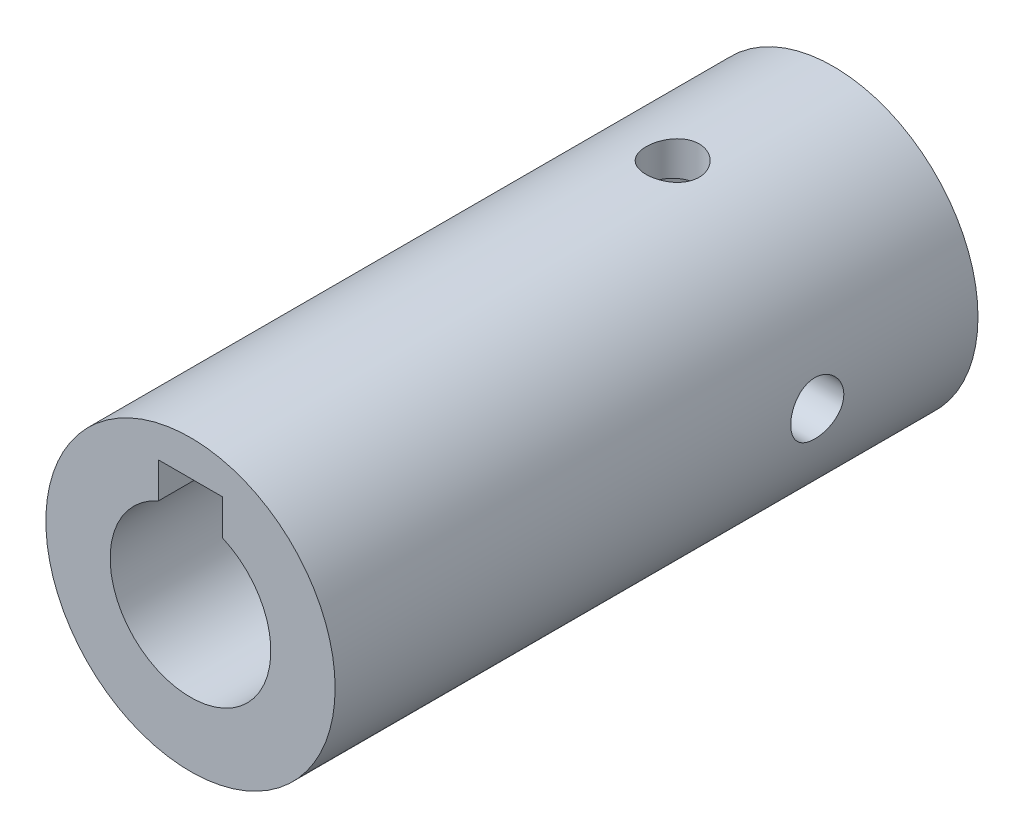
ISO-10303-21;
HEADER;
FILE_DESCRIPTION(('STEP AP214'),'2;1');
FILE_NAME('part.step','',(''),(''),'','','');
FILE_SCHEMA(('AUTOMOTIVE_DESIGN { 1 0 10303 214 1 1 1 1 }'));
ENDSEC;
DATA;
#1=APPLICATION_CONTEXT('core data for automotive mechanical design processes');
#2=APPLICATION_PROTOCOL_DEFINITION('international standard','automotive_design',2000,#1);
#3=PRODUCT_CONTEXT('',#1,'mechanical');
#4=PRODUCT('Part','Part','',(#3));
#5=PRODUCT_RELATED_PRODUCT_CATEGORY('part','',(#4));
#6=PRODUCT_DEFINITION_FORMATION('','',#4);
#7=PRODUCT_DEFINITION_CONTEXT('part definition',#1,'design');
#8=PRODUCT_DEFINITION('design','',#6,#7);
#9=PRODUCT_DEFINITION_SHAPE('','',#8);
#10=(LENGTH_UNIT() NAMED_UNIT(*) SI_UNIT(.MILLI.,.METRE.));
#11=(NAMED_UNIT(*) PLANE_ANGLE_UNIT() SI_UNIT($,.RADIAN.));
#12=(NAMED_UNIT(*) SI_UNIT($,.STERADIAN.) SOLID_ANGLE_UNIT());
#13=UNCERTAINTY_MEASURE_WITH_UNIT(LENGTH_MEASURE(1.E-05),#10,'distance_accuracy_value','');
#14=(GEOMETRIC_REPRESENTATION_CONTEXT(3) GLOBAL_UNCERTAINTY_ASSIGNED_CONTEXT((#13)) GLOBAL_UNIT_ASSIGNED_CONTEXT((#10,
#11,#12)) REPRESENTATION_CONTEXT('',''));
#15=CARTESIAN_POINT('',(0.,0.,0.));
#16=DIRECTION('',(0.,0.,1.));
#17=DIRECTION('',(1.,0.,0.));
#18=AXIS2_PLACEMENT_3D('',#15,#16,#17);
#19=CARTESIAN_POINT('',(0.,0.,40.));
#20=DIRECTION('',(0.,0.,1.));
#21=DIRECTION('',(1.,0.,0.));
#22=AXIS2_PLACEMENT_3D('',#19,#20,#21);
#23=PLANE('',#22);
#24=DIRECTION('',(0.,1.,0.));
#25=VECTOR('',#24,1.);
#26=CARTESIAN_POINT('',(2.,6.8,40.));
#27=LINE('',#26,#25);
#28=CARTESIAN_POINT('',(2.,4.58257569495584,40.));
#29=VERTEX_POINT('',#28);
#30=CARTESIAN_POINT('',(2.,6.8,40.));
#31=VERTEX_POINT('',#30);
#32=EDGE_CURVE('E87',#29,#31,#27,.T.);
#33=ORIENTED_EDGE('',*,*,#32,.F.);
#34=CARTESIAN_POINT('',(0.,0.,40.));
#35=DIRECTION('',(0.,0.,1.));
#36=DIRECTION('',(1.,0.,0.));
#37=AXIS2_PLACEMENT_3D('',#34,#35,#36);
#38=CIRCLE('',#37,5.);
#39=CARTESIAN_POINT('',(-2.,4.58257569495584,40.));
#40=VERTEX_POINT('',#39);
#41=EDGE_CURVE('E115',#40,#29,#38,.T.);
#42=ORIENTED_EDGE('',*,*,#41,.F.);
#43=DIRECTION('',(0.,-1.,0.));
#44=VECTOR('',#43,1.);
#45=CARTESIAN_POINT('',(-2.,6.8,40.));
#46=LINE('',#45,#44);
#47=CARTESIAN_POINT('',(-2.,6.8,40.));
#48=VERTEX_POINT('',#47);
#49=EDGE_CURVE('E56',#48,#40,#46,.T.);
#50=ORIENTED_EDGE('',*,*,#49,.F.);
#51=DIRECTION('',(-1.,0.,0.));
#52=VECTOR('',#51,1.);
#53=CARTESIAN_POINT('',(-2.,6.8,40.));
#54=LINE('',#53,#52);
#55=EDGE_CURVE('E105',#31,#48,#54,.T.);
#56=ORIENTED_EDGE('',*,*,#55,.F.);
#57=EDGE_LOOP('',(#33,#42,#50,#56));
#58=FACE_BOUND('',#57,.T.);
#59=CARTESIAN_POINT('',(0.,0.,40.));
#60=DIRECTION('',(0.,0.,1.));
#61=DIRECTION('',(1.,0.,0.));
#62=AXIS2_PLACEMENT_3D('',#59,#60,#61);
#63=CIRCLE('',#62,9.);
#64=CARTESIAN_POINT('',(9.,0.,40.));
#65=VERTEX_POINT('',#64);
#66=EDGE_CURVE('E120',#65,#65,#63,.T.);
#67=ORIENTED_EDGE('',*,*,#66,.T.);
#68=EDGE_LOOP('',(#67));
#69=FACE_BOUND('',#68,.T.);
#70=ADVANCED_FACE('F36',(#58,#69),#23,.T.);
#71=CARTESIAN_POINT('',(0.,0.,0.));
#72=DIRECTION('',(0.,0.,1.));
#73=DIRECTION('',(1.,0.,0.));
#74=AXIS2_PLACEMENT_3D('',#71,#72,#73);
#75=PLANE('',#74);
#76=CARTESIAN_POINT('',(0.,0.,0.));
#77=DIRECTION('',(0.,0.,1.));
#78=DIRECTION('',(1.,0.,0.));
#79=AXIS2_PLACEMENT_3D('',#76,#77,#78);
#80=CIRCLE('',#79,5.);
#81=CARTESIAN_POINT('',(-2.,4.58257569495584,0.));
#82=VERTEX_POINT('',#81);
#83=CARTESIAN_POINT('',(2.,4.58257569495584,0.));
#84=VERTEX_POINT('',#83);
#85=EDGE_CURVE('E103',#82,#84,#80,.T.);
#86=ORIENTED_EDGE('',*,*,#85,.T.);
#87=DIRECTION('',(0.,1.,0.));
#88=VECTOR('',#87,1.);
#89=CARTESIAN_POINT('',(2.,6.8,0.));
#90=LINE('',#89,#88);
#91=CARTESIAN_POINT('',(2.,6.8,0.));
#92=VERTEX_POINT('',#91);
#93=EDGE_CURVE('E84',#84,#92,#90,.T.);
#94=ORIENTED_EDGE('',*,*,#93,.T.);
#95=DIRECTION('',(-1.,0.,0.));
#96=VECTOR('',#95,1.);
#97=CARTESIAN_POINT('',(-2.,6.8,0.));
#98=LINE('',#97,#96);
#99=CARTESIAN_POINT('',(-2.,6.8,0.));
#100=VERTEX_POINT('',#99);
#101=EDGE_CURVE('E95',#92,#100,#98,.T.);
#102=ORIENTED_EDGE('',*,*,#101,.T.);
#103=DIRECTION('',(0.,-1.,0.));
#104=VECTOR('',#103,1.);
#105=CARTESIAN_POINT('',(-2.,6.8,0.));
#106=LINE('',#105,#104);
#107=EDGE_CURVE('E92',#100,#82,#106,.T.);
#108=ORIENTED_EDGE('',*,*,#107,.T.);
#109=EDGE_LOOP('',(#86,#94,#102,#108));
#110=FACE_BOUND('',#109,.T.);
#111=CARTESIAN_POINT('',(0.,0.,0.));
#112=DIRECTION('',(0.,0.,1.));
#113=DIRECTION('',(1.,0.,0.));
#114=AXIS2_PLACEMENT_3D('',#111,#112,#113);
#115=CIRCLE('',#114,9.);
#116=CARTESIAN_POINT('',(9.,0.,0.));
#117=VERTEX_POINT('',#116);
#118=EDGE_CURVE('E118',#117,#117,#115,.T.);
#119=ORIENTED_EDGE('',*,*,#118,.F.);
#120=EDGE_LOOP('',(#119));
#121=FACE_BOUND('',#120,.T.);
#122=ADVANCED_FACE('F100',(#110,#121),#75,.F.);
#123=CARTESIAN_POINT('',(0.,0.,40.));
#124=DIRECTION('',(0.,0.,-1.));
#125=DIRECTION('',(-1.,0.,0.));
#126=AXIS2_PLACEMENT_3D('',#123,#124,#125);
#127=CYLINDRICAL_SURFACE('',#126,9.);
#128=CARTESIAN_POINT('',(9.,0.,11.65));
#129=CARTESIAN_POINT('',(8.99999835060966,0.0918563401856291,11.6499964511914));
#130=CARTESIAN_POINT('',(8.99857918884985,0.183759286218882,11.6423035469141));
#131=CARTESIAN_POINT('',(8.99305463028745,0.364977948965814,11.6117535309859));
#132=CARTESIAN_POINT('',(8.98894692395007,0.454291372258896,11.5888833814225));
#133=CARTESIAN_POINT('',(8.97850503368058,0.627683743604389,11.5287005963663));
#134=CARTESIAN_POINT('',(8.97217282164655,0.711767250233595,11.4914007490276));
#135=CARTESIAN_POINT('',(8.95797438424648,0.872474263435695,11.4034531032473));
#136=CARTESIAN_POINT('',(8.95010829368215,0.949098424671128,11.3528064776222));
#137=CARTESIAN_POINT('',(8.9336102101443,1.09359910356556,11.2389858907854));
#138=CARTESIAN_POINT('',(8.92497117839848,1.16137765650479,11.1756885659969));
#139=CARTESIAN_POINT('',(8.90795346370862,1.28541590153586,11.0386287745025));
#140=CARTESIAN_POINT('',(8.8995747990063,1.34167478807872,10.9648655765476));
#141=CARTESIAN_POINT('',(8.88395813367482,1.44148110351233,10.8082795809184));
#142=CARTESIAN_POINT('',(8.87672921329071,1.48492945431507,10.725392646736));
#143=CARTESIAN_POINT('',(8.86432940629067,1.55724724466982,10.5533414665414));
#144=CARTESIAN_POINT('',(8.85915835034377,1.58611788379855,10.4641777377249));
#145=CARTESIAN_POINT('',(8.85153045632432,1.628147498374,10.2831502536457));
#146=CARTESIAN_POINT('',(8.84904418663057,1.64147697365671,10.1913273482505));
#147=CARTESIAN_POINT('',(8.84697857859139,1.65257498692856,10.0067172962398));
#148=CARTESIAN_POINT('',(8.84739899114242,1.65034485838023,9.91393023293356));
#149=CARTESIAN_POINT('',(8.85107243387296,1.63052535234045,9.7312571786351));
#150=CARTESIAN_POINT('',(8.85428979801769,1.61312935830109,9.64134938325371));
#151=CARTESIAN_POINT('',(8.86313864762649,1.56377625687946,9.4657504474543));
#152=CARTESIAN_POINT('',(8.86877023157548,1.53181855546815,9.38005947921519));
#153=CARTESIAN_POINT('',(8.88185052793626,1.4540586374682,9.21475808748164));
#154=CARTESIAN_POINT('',(8.88930950236372,1.40817787366259,9.13518545915314));
#155=CARTESIAN_POINT('',(8.90519728772881,1.30392981237182,8.98479541868752));
#156=CARTESIAN_POINT('',(8.91362619286663,1.24556130159629,8.91397885833225));
#157=CARTESIAN_POINT('',(8.93065979872225,1.11694967129332,8.78199341422243));
#158=CARTESIAN_POINT('',(8.93926523580672,1.04654103501511,8.72098579665601));
#159=CARTESIAN_POINT('',(8.95556555246463,0.896402881240975,8.6116242921601));
#160=CARTESIAN_POINT('',(8.96326042365318,0.816673277926886,8.56327052174789));
#161=CARTESIAN_POINT('',(8.97688712058931,0.649991673656466,8.4805674514699));
#162=CARTESIAN_POINT('',(8.98281689925138,0.563031435204716,8.44623439525882));
#163=CARTESIAN_POINT('',(8.9922293552611,0.384445293378825,8.39270757787582));
#164=CARTESIAN_POINT('',(8.99571228095924,0.292819864524539,8.37351228022857));
#165=CARTESIAN_POINT('',(8.9998046368878,0.108892206896277,8.35102910531887));
#166=CARTESIAN_POINT('',(9.00045399362833,0.0166178578028444,8.3475201812148));
#167=CARTESIAN_POINT('',(8.99891614087115,-0.167199268852813,8.35591717889622));
#168=CARTESIAN_POINT('',(8.99672906437169,-0.258742080513784,8.3678223779249));
#169=CARTESIAN_POINT('',(8.9897889173344,-0.437800271906288,8.40652587438453));
#170=CARTESIAN_POINT('',(8.98505503856335,-0.525340527688906,8.4332128258482));
#171=CARTESIAN_POINT('',(8.97354987691929,-0.694704345256288,8.50060216535141));
#172=CARTESIAN_POINT('',(8.96677846051344,-0.776527531931818,8.54130547199743));
#173=CARTESIAN_POINT('',(8.95184977853793,-0.933081448267931,8.63606489383059));
#174=CARTESIAN_POINT('',(8.94367870992649,-1.00772869905809,8.69025670761984));
#175=CARTESIAN_POINT('',(8.92689385571355,-1.14694904497453,8.81027058406274));
#176=CARTESIAN_POINT('',(8.91828003076047,-1.21152124257849,8.87609368176082));
#177=CARTESIAN_POINT('',(8.90144873167934,-1.32959418699788,9.01850049100402));
#178=CARTESIAN_POINT('',(8.89323765758647,-1.38294438582436,9.0952099064701));
#179=CARTESIAN_POINT('',(8.87826835621664,-1.4760019251271,9.25663173002978));
#180=CARTESIAN_POINT('',(8.87151007645345,-1.51570975850265,9.34134384884433));
#181=CARTESIAN_POINT('',(8.86026133433789,-1.58013949319581,9.51597613701553));
#182=CARTESIAN_POINT('',(8.85576025982359,-1.60493163214764,9.60586967724311));
#183=CARTESIAN_POINT('',(8.84951079711017,-1.63904383383449,9.78863616379072));
#184=CARTESIAN_POINT('',(8.84776211350983,-1.64836555694266,9.88150878928763));
#185=CARTESIAN_POINT('',(8.8472299450701,-1.65121867237614,10.0660901688092));
#186=CARTESIAN_POINT('',(8.84840188735807,-1.64498742277089,10.1577952099332));
#187=CARTESIAN_POINT('',(8.85348032699231,-1.61742979277769,10.3388272942866));
#188=CARTESIAN_POINT('',(8.8573868096795,-1.59610349330992,10.4281543502609));
#189=CARTESIAN_POINT('',(8.867475774888,-1.53905940273944,10.6017745964563));
#190=CARTESIAN_POINT('',(8.87365436407452,-1.50336621996412,10.6860761126321));
#191=CARTESIAN_POINT('',(8.88759431680627,-1.41862715875643,10.8475322777078));
#192=CARTESIAN_POINT('',(8.89535578533286,-1.36958039460183,10.9246864520806));
#193=CARTESIAN_POINT('',(8.91172595985397,-1.25869662766806,11.0708489633579));
#194=CARTESIAN_POINT('',(8.92034520947617,-1.19668647580681,11.1397247845049));
#195=CARTESIAN_POINT('',(8.93737982765602,-1.06199820645018,11.2661728663384));
#196=CARTESIAN_POINT('',(8.94579514890086,-0.989317640435666,11.3237425255149));
#197=CARTESIAN_POINT('',(8.96155795714123,-0.834608091559628,11.4264021209736));
#198=CARTESIAN_POINT('',(8.96889569784106,-0.752504485294222,11.4713811345629));
#199=CARTESIAN_POINT('',(8.9815815504526,-0.581799309328924,11.546835790754));
#200=CARTESIAN_POINT('',(8.98693155389526,-0.493204013757845,11.5773252293893));
#201=CARTESIAN_POINT('',(8.99393221000113,-0.33694160703953,11.616654539549));
#202=CARTESIAN_POINT('',(8.99619492659055,-0.270195109334186,11.6291380026608));
#203=CARTESIAN_POINT('',(8.99922941304804,-0.135640863042976,11.6458119455883));
#204=CARTESIAN_POINT('',(9.00000121802507,-0.0678331394854611,11.6500026206882));
#205=CARTESIAN_POINT('',(9.,0.,11.65));
#206=B_SPLINE_CURVE_WITH_KNOTS('',3,(#128,#129,#130,#131,#132,#133,#134,#135,#136,#137,#138,
#139,#140,#141,#142,#143,#144,#145,#146,#147,#148,#149,#150,#151,#152,#153,#154,#155,#156,#157,
#158,#159,#160,#161,#162,#163,#164,#165,#166,#167,#168,#169,#170,#171,#172,#173,#174,#175,#176,
#177,#178,#179,#180,#181,#182,#183,#184,#185,#186,#187,#188,#189,#190,#191,#192,#193,#194,#195,
#196,#197,#198,#199,#200,#201,#202,#203,#204,#205),.UNSPECIFIED.,.T.,.F.,(4,2,2,2,2,2,2,2,2,2,2,
2,2,2,2,2,2,2,2,2,2,2,2,2,2,2,2,2,2,2,2,2,2,2,2,2,2,2,4),(0.,0.275320976133016,
0.550878771625987,0.826192914580021,1.1014828730185,1.37960125011388,1.6577390688762,
1.93797477063959,2.2181874084928,2.49529605356488,2.77238095063822,3.04598351388715,
3.31959723945499,3.59478420042089,3.86999791028248,4.14935425298784,4.4287131679304,
4.7083948213042,4.98804808346798,5.26374788907696,5.53943476779431,5.81307268892924,
6.08672854721141,6.36325739026109,6.63981085345673,6.91986622510814,7.19991147728186,
7.47862746599062,7.75731353937686,8.03177259289667,8.30623017513215,8.58021963948807,
8.85422728156676,9.13215992874282,9.41015645255448,9.6905301063063,9.970636268935,
10.1739573020538,10.377273547177),.UNSPECIFIED.);
#207=CARTESIAN_POINT('',(9.,0.,11.65));
#208=VERTEX_POINT('',#207);
#209=EDGE_CURVE('E11',#208,#208,#206,.T.);
#210=ORIENTED_EDGE('',*,*,#209,.T.);
#211=EDGE_LOOP('',(#210));
#212=FACE_BOUND('',#211,.T.);
#213=CARTESIAN_POINT('',(0.,9.,8.35000000000001));
#214=CARTESIAN_POINT('',(0.0918563401856291,8.99999835060966,8.35000354880864));
#215=CARTESIAN_POINT('',(0.183759286218882,8.99857918884985,8.35769645308593));
#216=CARTESIAN_POINT('',(0.364977948965814,8.99305463028745,8.38824646901408));
#217=CARTESIAN_POINT('',(0.454291372258896,8.98894692395007,8.41111661857755));
#218=CARTESIAN_POINT('',(0.627683743604389,8.97850503368058,8.47129940363373));
#219=CARTESIAN_POINT('',(0.711767250233595,8.97217282164655,8.50859925097237));
#220=CARTESIAN_POINT('',(0.872474263435695,8.95797438424648,8.59654689675269));
#221=CARTESIAN_POINT('',(0.949098424671129,8.95010829368215,8.64719352237785));
#222=CARTESIAN_POINT('',(1.09359910356556,8.9336102101443,8.76101410921455));
#223=CARTESIAN_POINT('',(1.16137765650479,8.92497117839848,8.8243114340031));
#224=CARTESIAN_POINT('',(1.28541590153585,8.90795346370862,8.96137122549753));
#225=CARTESIAN_POINT('',(1.34167478807872,8.8995747990063,9.03513442345237));
#226=CARTESIAN_POINT('',(1.44148110351233,8.88395813367482,9.19172041908156));
#227=CARTESIAN_POINT('',(1.48492945431507,8.87672921329071,9.27460735326401));
#228=CARTESIAN_POINT('',(1.55724724466982,8.86432940629067,9.4466585334586));
#229=CARTESIAN_POINT('',(1.58611788379855,8.85915835034377,9.53582226227507));
#230=CARTESIAN_POINT('',(1.628147498374,8.85153045632432,9.71684974635425));
#231=CARTESIAN_POINT('',(1.64147697365671,8.84904418663057,9.80867265174954));
#232=CARTESIAN_POINT('',(1.65257498692856,8.84697857859139,9.99328270376019));
#233=CARTESIAN_POINT('',(1.65034485838023,8.84739899114242,10.0860697670664));
#234=CARTESIAN_POINT('',(1.63052535234045,8.85107243387296,10.2687428213649));
#235=CARTESIAN_POINT('',(1.61312935830109,8.85428979801769,10.3586506167463));
#236=CARTESIAN_POINT('',(1.56377625687946,8.86313864762649,10.5342495525457));
#237=CARTESIAN_POINT('',(1.53181855546815,8.86877023157548,10.6199405207848));
#238=CARTESIAN_POINT('',(1.4540586374682,8.88185052793626,10.7852419125184));
#239=CARTESIAN_POINT('',(1.40817787366259,8.88930950236372,10.8648145408469));
#240=CARTESIAN_POINT('',(1.30392981237182,8.90519728772881,11.0152045813125));
#241=CARTESIAN_POINT('',(1.24556130159629,8.91362619286663,11.0860211416678));
#242=CARTESIAN_POINT('',(1.11694967129332,8.93065979872225,11.2180065857776));
#243=CARTESIAN_POINT('',(1.04654103501511,8.93926523580672,11.279014203344));
#244=CARTESIAN_POINT('',(0.896402881240975,8.95556555246463,11.3883757078399));
#245=CARTESIAN_POINT('',(0.816673277926886,8.96326042365318,11.4367294782521));
#246=CARTESIAN_POINT('',(0.649991673656466,8.97688712058931,11.5194325485301));
#247=CARTESIAN_POINT('',(0.563031435204716,8.98281689925138,11.5537656047412));
#248=CARTESIAN_POINT('',(0.384445293378825,8.9922293552611,11.6072924221242));
#249=CARTESIAN_POINT('',(0.292819864524539,8.99571228095924,11.6264877197714));
#250=CARTESIAN_POINT('',(0.108892206896277,8.9998046368878,11.6489708946811));
#251=CARTESIAN_POINT('',(0.0166178578028442,9.00045399362833,11.6524798187852));
#252=CARTESIAN_POINT('',(-0.167199268852813,8.99891614087115,11.6440828211038));
#253=CARTESIAN_POINT('',(-0.258742080513784,8.99672906437169,11.6321776220751));
#254=CARTESIAN_POINT('',(-0.437800271906288,8.9897889173344,11.5934741256155));
#255=CARTESIAN_POINT('',(-0.525340527688906,8.98505503856335,11.5667871741518));
#256=CARTESIAN_POINT('',(-0.694704345256288,8.97354987691929,11.4993978346486));
#257=CARTESIAN_POINT('',(-0.776527531931818,8.96677846051344,11.4586945280026));
#258=CARTESIAN_POINT('',(-0.933081448267931,8.95184977853793,11.3639351061694));
#259=CARTESIAN_POINT('',(-1.00772869905809,8.94367870992649,11.3097432923802));
#260=CARTESIAN_POINT('',(-1.14694904497453,8.92689385571355,11.1897294159373));
#261=CARTESIAN_POINT('',(-1.21152124257849,8.91828003076047,11.1239063182392));
#262=CARTESIAN_POINT('',(-1.32959418699788,8.90144873167934,10.981499508996));
#263=CARTESIAN_POINT('',(-1.38294438582436,8.89323765758647,10.9047900935299));
#264=CARTESIAN_POINT('',(-1.4760019251271,8.87826835621664,10.7433682699702));
#265=CARTESIAN_POINT('',(-1.51570975850265,8.87151007645345,10.6586561511557));
#266=CARTESIAN_POINT('',(-1.58013949319581,8.86026133433789,10.4840238629845));
#267=CARTESIAN_POINT('',(-1.60493163214764,8.85576025982359,10.3941303227569));
#268=CARTESIAN_POINT('',(-1.63904383383449,8.84951079711017,10.2113638362093));
#269=CARTESIAN_POINT('',(-1.64836555694266,8.84776211350983,10.1184912107124));
#270=CARTESIAN_POINT('',(-1.65121867237614,8.8472299450701,9.93390983119083));
#271=CARTESIAN_POINT('',(-1.64498742277089,8.84840188735807,9.84220479006679));
#272=CARTESIAN_POINT('',(-1.61742979277769,8.85348032699231,9.66117270571342));
#273=CARTESIAN_POINT('',(-1.59610349330992,8.8573868096795,9.57184564973906));
#274=CARTESIAN_POINT('',(-1.53905940273943,8.86747577488801,9.39822540354369));
#275=CARTESIAN_POINT('',(-1.50336621996412,8.87365436407452,9.31392388736786));
#276=CARTESIAN_POINT('',(-1.41862715875642,8.88759431680627,9.15246772229217));
#277=CARTESIAN_POINT('',(-1.36958039460183,8.89535578533286,9.07531354791945));
#278=CARTESIAN_POINT('',(-1.25869662766806,8.91172595985397,8.92915103664209));
#279=CARTESIAN_POINT('',(-1.19668647580681,8.92034520947617,8.86027521549507));
#280=CARTESIAN_POINT('',(-1.06199820645018,8.93737982765602,8.7338271336616));
#281=CARTESIAN_POINT('',(-0.989317640435665,8.94579514890086,8.67625747448513));
#282=CARTESIAN_POINT('',(-0.834608091559628,8.96155795714123,8.57359787902638));
#283=CARTESIAN_POINT('',(-0.752504485294222,8.96889569784106,8.52861886543706));
#284=CARTESIAN_POINT('',(-0.581799309328924,8.9815815504526,8.453164209246));
#285=CARTESIAN_POINT('',(-0.493204013757845,8.98693155389526,8.42267477061075));
#286=CARTESIAN_POINT('',(-0.33694160703953,8.99393221000113,8.38334546045097));
#287=CARTESIAN_POINT('',(-0.270195109334186,8.99619492659055,8.37086199733922));
#288=CARTESIAN_POINT('',(-0.135640863042976,8.99922941304804,8.35418805441165));
#289=CARTESIAN_POINT('',(-0.0678331394854611,9.00000121802507,8.34999737931176));
#290=CARTESIAN_POINT('',(0.,9.,8.35000000000001));
#291=B_SPLINE_CURVE_WITH_KNOTS('',3,(#213,#214,#215,#216,#217,#218,#219,#220,#221,#222,#223,
#224,#225,#226,#227,#228,#229,#230,#231,#232,#233,#234,#235,#236,#237,#238,#239,#240,#241,#242,
#243,#244,#245,#246,#247,#248,#249,#250,#251,#252,#253,#254,#255,#256,#257,#258,#259,#260,#261,
#262,#263,#264,#265,#266,#267,#268,#269,#270,#271,#272,#273,#274,#275,#276,#277,#278,#279,#280,
#281,#282,#283,#284,#285,#286,#287,#288,#289,#290),.UNSPECIFIED.,.T.,.F.,(4,2,2,2,2,2,2,2,2,2,2,
2,2,2,2,2,2,2,2,2,2,2,2,2,2,2,2,2,2,2,2,2,2,2,2,2,2,2,4),(0.,0.275320976133017,
0.550878771625987,0.826192914580021,1.1014828730185,1.37960125011388,1.6577390688762,
1.93797477063959,2.2181874084928,2.49529605356488,2.77238095063822,3.04598351388716,
3.31959723945499,3.59478420042089,3.86999791028248,4.14935425298784,4.4287131679304,
4.7083948213042,4.98804808346798,5.26374788907696,5.53943476779431,5.81307268892924,
6.08672854721141,6.36325739026109,6.63981085345673,6.91986622510814,7.19991147728185,
7.47862746599062,7.75731353937686,8.03177259289667,8.30623017513215,8.58021963948808,
8.85422728156676,9.13215992874282,9.41015645255448,9.6905301063063,9.970636268935,
10.1739573020538,10.377273547177),.UNSPECIFIED.);
#292=CARTESIAN_POINT('',(0.,9.,8.35000000000001));
#293=VERTEX_POINT('',#292);
#294=EDGE_CURVE('E49',#293,#293,#291,.T.);
#295=ORIENTED_EDGE('',*,*,#294,.T.);
#296=EDGE_LOOP('',(#295));
#297=FACE_BOUND('',#296,.T.);
#298=ORIENTED_EDGE('',*,*,#66,.F.);
#299=EDGE_LOOP('',(#298));
#300=FACE_BOUND('',#299,.T.);
#301=ORIENTED_EDGE('',*,*,#118,.T.);
#302=EDGE_LOOP('',(#301));
#303=FACE_BOUND('',#302,.T.);
#304=ADVANCED_FACE('F38',(#212,#297,#300,#303),#127,.T.);
#305=CARTESIAN_POINT('',(0.,0.,40.));
#306=DIRECTION('',(0.,0.,-1.));
#307=DIRECTION('',(-1.,0.,0.));
#308=AXIS2_PLACEMENT_3D('',#305,#306,#307);
#309=CYLINDRICAL_SURFACE('',#308,5.);
#310=CARTESIAN_POINT('',(5.,0.,11.65));
#311=CARTESIAN_POINT('',(5.00000012564882,0.0900803323989864,11.6500002425144));
#312=CARTESIAN_POINT('',(4.99754312617873,0.180159574077353,11.642599162515));
#313=CARTESIAN_POINT('',(4.98798348171153,0.357667875169256,11.6132788504724));
#314=CARTESIAN_POINT('',(4.98088026257135,0.445096605656319,11.5913578241647));
#315=CARTESIAN_POINT('',(4.96280068143201,0.614719075952392,11.5338286876117));
#316=CARTESIAN_POINT('',(4.95183071876684,0.696921201899963,11.498243182986));
#317=CARTESIAN_POINT('',(4.92713947248839,0.85419064587448,11.4144964273081));
#318=CARTESIAN_POINT('',(4.91341766335966,0.929256597076051,11.3663327736966));
#319=CARTESIAN_POINT('',(4.88414667976015,1.07267700256014,11.2570751769286));
#320=CARTESIAN_POINT('',(4.86855436886588,1.140755021368,11.1956299817258));
#321=CARTESIAN_POINT('',(4.83753907804007,1.26585047260416,11.0623004860802));
#322=CARTESIAN_POINT('',(4.8221161350793,1.32286553369749,10.9904139533073));
#323=CARTESIAN_POINT('',(4.79271313173334,1.42578155512387,10.8357693876205));
#324=CARTESIAN_POINT('',(4.77878574898835,1.47132547146369,10.7527627624148));
#325=CARTESIAN_POINT('',(4.75460549483772,1.5476895000705,10.5797343691659));
#326=CARTESIAN_POINT('',(4.74435152777497,1.57851400356115,10.4897147026477));
#327=CARTESIAN_POINT('',(4.72913282635101,1.62353134991423,10.3083551709187));
#328=CARTESIAN_POINT('',(4.72400412235767,1.63824134173319,10.2171578366744));
#329=CARTESIAN_POINT('',(4.7191313464795,1.65222861163855,10.033456387306));
#330=CARTESIAN_POINT('',(4.71938564975367,1.65151054662634,9.94095267493226));
#331=CARTESIAN_POINT('',(4.72510629107569,1.63506410098719,9.76165279760769));
#332=CARTESIAN_POINT('',(4.73033928879682,1.62000769651632,9.67478626476119));
#333=CARTESIAN_POINT('',(4.74504632523488,1.57640708934976,9.50488909383327));
#334=CARTESIAN_POINT('',(4.75452086227439,1.54786130181505,9.42185890773474));
#335=CARTESIAN_POINT('',(4.77681173941,1.47764674240872,9.26045256000537));
#336=CARTESIAN_POINT('',(4.78967871947683,1.43577693123635,9.18217114977468));
#337=CARTESIAN_POINT('',(4.81728315916032,1.34024242388314,9.03353163769848));
#338=CARTESIAN_POINT('',(4.8320211498719,1.28657437554158,8.96317579630595));
#339=CARTESIAN_POINT('',(4.86262798242566,1.16572801734404,8.82860477258979));
#340=CARTESIAN_POINT('',(4.87851612594017,1.09799945388895,8.76488712135686));
#341=CARTESIAN_POINT('',(4.9089733458653,0.952622363558084,8.64958582176081));
#342=CARTESIAN_POINT('',(4.92354230068063,0.874972923819717,8.59800329124502));
#343=CARTESIAN_POINT('',(4.94990429259939,0.710918878360193,8.50804648316299));
#344=CARTESIAN_POINT('',(4.96166947936115,0.624437715003006,8.46980310278696));
#345=CARTESIAN_POINT('',(4.98089634514735,0.445788820584335,8.40856028039371));
#346=CARTESIAN_POINT('',(4.98835948795835,0.353623035566634,8.38555565293588));
#347=CARTESIAN_POINT('',(4.9979000192954,0.170434936942809,8.35631921461675));
#348=CARTESIAN_POINT('',(5.00019320840939,0.0795310449403315,8.34941490636055));
#349=CARTESIAN_POINT('',(4.99978120399321,-0.10215299707419,8.35066263269127));
#350=CARTESIAN_POINT('',(4.99707683523427,-0.19293316503069,8.35881218286676));
#351=CARTESIAN_POINT('',(4.98711592890817,-0.369117276094976,8.38940282618291));
#352=CARTESIAN_POINT('',(4.97999029806496,-0.454600657078432,8.41143321001453));
#353=CARTESIAN_POINT('',(4.9620361021664,-0.620625393385986,8.46864869151176));
#354=CARTESIAN_POINT('',(4.9512070668376,-0.701166119538831,8.5038354598819));
#355=CARTESIAN_POINT('',(4.92659738190256,-0.857353583850654,8.58738101955237));
#356=CARTESIAN_POINT('',(4.91274728599484,-0.932818538636807,8.6360586147645));
#357=CARTESIAN_POINT('',(4.8836680633903,-1.07472879779132,8.74482823479592));
#358=CARTESIAN_POINT('',(4.86843852373584,-1.14117138619964,8.80492368367397));
#359=CARTESIAN_POINT('',(4.83745909847491,-1.26622547851876,8.93798617269196));
#360=CARTESIAN_POINT('',(4.82171620160002,-1.32435715949936,9.0114068669237));
#361=CARTESIAN_POINT('',(4.79218567046633,-1.42753142742357,9.16729985489369));
#362=CARTESIAN_POINT('',(4.77839804366633,-1.47257396443646,9.24977218315924));
#363=CARTESIAN_POINT('',(4.75447746870334,-1.54806908435207,9.42142548395834));
#364=CARTESIAN_POINT('',(4.74433588191365,-1.57855621066784,9.51058998597722));
#365=CARTESIAN_POINT('',(4.728992662468,-1.62395003915295,9.6931979020796));
#366=CARTESIAN_POINT('',(4.72378886275909,-1.63886357641239,9.78663942021203));
#367=CARTESIAN_POINT('',(4.71915352744858,-1.65216049477083,9.97008542491291));
#368=CARTESIAN_POINT('',(4.71944442417867,-1.6513387236508,10.0600259363782));
#369=CARTESIAN_POINT('',(4.72508139490563,-1.63513842564513,10.2384165995902));
#370=CARTESIAN_POINT('',(4.7304271793221,-1.61976073262755,10.3268668364151));
#371=CARTESIAN_POINT('',(4.74536693764462,-1.57544291875231,10.4981641371846));
#372=CARTESIAN_POINT('',(4.75488165289364,-1.54675527092969,10.5810839721575));
#373=CARTESIAN_POINT('',(4.77705935615133,-1.47683540940045,10.7409974926626));
#374=CARTESIAN_POINT('',(4.78972303393434,-1.43560044678476,10.8179898749519));
#375=CARTESIAN_POINT('',(4.81744939348764,-1.33969084183065,10.9674434543664));
#376=CARTESIAN_POINT('',(4.83259170443489,-1.28451538865981,11.0395684110698));
#377=CARTESIAN_POINT('',(4.86323043063064,-1.16314331347536,11.173792580675));
#378=CARTESIAN_POINT('',(4.87872694403302,-1.09694360376003,11.2358889751267));
#379=CARTESIAN_POINT('',(4.90903317548774,-0.952387676734105,11.3506633318092));
#380=CARTESIAN_POINT('',(4.92379458911327,-0.873665758138168,11.4028950216852));
#381=CARTESIAN_POINT('',(4.95031750248797,-0.708077082051266,11.4933248578978));
#382=CARTESIAN_POINT('',(4.96207983840249,-0.621212604024477,11.5315269171114));
#383=CARTESIAN_POINT('',(4.98076953032462,-0.44638654187221,11.5910130150305));
#384=CARTESIAN_POINT('',(4.98791371763214,-0.35870915508395,11.613063522484));
#385=CARTESIAN_POINT('',(4.99752827480817,-0.180687007883426,11.6425549720432));
#386=CARTESIAN_POINT('',(4.99999987398486,-0.0903429553968467,11.6499997567786));
#387=CARTESIAN_POINT('',(5.,0.,11.65));
#388=B_SPLINE_CURVE_WITH_KNOTS('',3,(#310,#311,#312,#313,#314,#315,#316,#317,#318,#319,#320,
#321,#322,#323,#324,#325,#326,#327,#328,#329,#330,#331,#332,#333,#334,#335,#336,#337,#338,#339,
#340,#341,#342,#343,#344,#345,#346,#347,#348,#349,#350,#351,#352,#353,#354,#355,#356,#357,#358,
#359,#360,#361,#362,#363,#364,#365,#366,#367,#368,#369,#370,#371,#372,#373,#374,#375,#376,#377,
#378,#379,#380,#381,#382,#383,#384,#385,#386,#387),.UNSPECIFIED.,.T.,.F.,(4,2,2,2,2,2,2,2,2,2,2,
2,2,2,2,2,2,2,2,2,2,2,2,2,2,2,2,2,2,2,2,2,2,2,2,2,2,2,4),(0.,0.269908604132499,
0.539850567737245,0.809347867689091,1.07889668217443,1.3567121576595,1.63458711701567,
1.92026489148116,2.20585738673401,2.48198869358465,2.75803665240172,3.02175295330503,
3.28550024538371,3.55343249441285,3.82144096800203,4.10314526837293,4.38487550826385,
4.66929734218006,4.95362234329172,5.22584041060144,5.4980135564539,5.76248915124945,
6.02699834271652,6.29838751507402,6.56985820217366,6.85340472718151,7.13695233381083,
7.41982362841784,7.70257072144069,7.97107468624607,8.23956327014093,8.50315503612408,
8.76680459233088,9.04176838412558,9.31680931840234,9.60227659952694,9.88766420298741,
10.1584309528124,10.4291264568694),.UNSPECIFIED.);
#389=CARTESIAN_POINT('',(5.,0.,11.65));
#390=VERTEX_POINT('',#389);
#391=EDGE_CURVE('E152',#390,#390,#388,.T.);
#392=ORIENTED_EDGE('',*,*,#391,.F.);
#393=EDGE_LOOP('',(#392));
#394=FACE_BOUND('',#393,.T.);
#395=DIRECTION('',(0.,0.,-1.));
#396=VECTOR('',#395,1.);
#397=CARTESIAN_POINT('',(2.,4.58257569495584,40.));
#398=LINE('',#397,#396);
#399=EDGE_CURVE('E126',#84,#29,#398,.F.);
#400=ORIENTED_EDGE('',*,*,#399,.F.);
#401=ORIENTED_EDGE('',*,*,#85,.F.);
#402=DIRECTION('',(0.,0.,-1.));
#403=VECTOR('',#402,1.);
#404=CARTESIAN_POINT('',(-2.,4.58257569495584,40.));
#405=LINE('',#404,#403);
#406=EDGE_CURVE('E60',#40,#82,#405,.T.);
#407=ORIENTED_EDGE('',*,*,#406,.F.);
#408=ORIENTED_EDGE('',*,*,#41,.T.);
#409=EDGE_LOOP('',(#400,#401,#407,#408));
#410=FACE_BOUND('',#409,.T.);
#411=ADVANCED_FACE('F147',(#394,#410),#309,.F.);
#412=CARTESIAN_POINT('',(2.,6.8,0.));
#413=DIRECTION('',(1.,0.,0.));
#414=DIRECTION('',(0.,1.,0.));
#415=AXIS2_PLACEMENT_3D('',#412,#413,#414);
#416=PLANE('',#415);
#417=ORIENTED_EDGE('',*,*,#399,.T.);
#418=ORIENTED_EDGE('',*,*,#32,.T.);
#419=DIRECTION('',(0.,0.,1.));
#420=VECTOR('',#419,1.);
#421=CARTESIAN_POINT('',(2.,6.8,0.));
#422=LINE('',#421,#420);
#423=EDGE_CURVE('E80',#92,#31,#422,.T.);
#424=ORIENTED_EDGE('',*,*,#423,.F.);
#425=ORIENTED_EDGE('',*,*,#93,.F.);
#426=EDGE_LOOP('',(#417,#418,#424,#425));
#427=FACE_BOUND('',#426,.T.);
#428=ADVANCED_FACE('F82',(#427),#416,.F.);
#429=CARTESIAN_POINT('',(-2.,6.8,0.));
#430=DIRECTION('',(-1.,0.,0.));
#431=DIRECTION('',(0.,-1.,0.));
#432=AXIS2_PLACEMENT_3D('',#429,#430,#431);
#433=PLANE('',#432);
#434=ORIENTED_EDGE('',*,*,#406,.T.);
#435=ORIENTED_EDGE('',*,*,#107,.F.);
#436=DIRECTION('',(0.,0.,1.));
#437=VECTOR('',#436,1.);
#438=CARTESIAN_POINT('',(-2.,6.8,0.));
#439=LINE('',#438,#437);
#440=EDGE_CURVE('E91',#100,#48,#439,.T.);
#441=ORIENTED_EDGE('',*,*,#440,.T.);
#442=ORIENTED_EDGE('',*,*,#49,.T.);
#443=EDGE_LOOP('',(#434,#435,#441,#442));
#444=FACE_BOUND('',#443,.T.);
#445=ADVANCED_FACE('F139',(#444),#433,.F.);
#446=CARTESIAN_POINT('',(-2.,6.8,0.));
#447=DIRECTION('',(0.,1.,0.));
#448=DIRECTION('',(0.,0.,1.));
#449=AXIS2_PLACEMENT_3D('',#446,#447,#448);
#450=PLANE('',#449);
#451=CARTESIAN_POINT('',(0.,6.8,10.));
#452=DIRECTION('',(0.,1.,0.));
#453=DIRECTION('',(0.,0.,1.));
#454=AXIS2_PLACEMENT_3D('',#451,#452,#453);
#455=CIRCLE('',#454,1.64999999999999);
#456=CARTESIAN_POINT('',(0.,6.8,11.65));
#457=VERTEX_POINT('',#456);
#458=EDGE_CURVE('E108',#457,#457,#455,.T.);
#459=ORIENTED_EDGE('',*,*,#458,.T.);
#460=EDGE_LOOP('',(#459));
#461=FACE_BOUND('',#460,.T.);
#462=ORIENTED_EDGE('',*,*,#55,.T.);
#463=ORIENTED_EDGE('',*,*,#440,.F.);
#464=ORIENTED_EDGE('',*,*,#101,.F.);
#465=ORIENTED_EDGE('',*,*,#423,.T.);
#466=EDGE_LOOP('',(#462,#463,#464,#465));
#467=FACE_BOUND('',#466,.T.);
#468=ADVANCED_FACE('F96',(#461,#467),#450,.F.);
#469=CARTESIAN_POINT('',(0.,0.,10.));
#470=DIRECTION('',(0.,-1.,0.));
#471=DIRECTION('',(0.,0.,-1.));
#472=AXIS2_PLACEMENT_3D('',#469,#470,#471);
#473=CYLINDRICAL_SURFACE('',#472,1.64999999999999);
#474=ORIENTED_EDGE('',*,*,#294,.F.);
#475=EDGE_LOOP('',(#474));
#476=FACE_BOUND('',#475,.T.);
#477=ORIENTED_EDGE('',*,*,#458,.F.);
#478=EDGE_LOOP('',(#477));
#479=FACE_BOUND('',#478,.T.);
#480=ADVANCED_FACE('F132',(#476,#479),#473,.F.);
#481=CARTESIAN_POINT('',(0.,0.,10.));
#482=DIRECTION('',(-1.,0.,0.));
#483=DIRECTION('',(0.,0.,1.));
#484=AXIS2_PLACEMENT_3D('',#481,#482,#483);
#485=CYLINDRICAL_SURFACE('',#484,1.64999999999999);
#486=ORIENTED_EDGE('',*,*,#391,.T.);
#487=EDGE_LOOP('',(#486));
#488=FACE_BOUND('',#487,.T.);
#489=ORIENTED_EDGE('',*,*,#209,.F.);
#490=EDGE_LOOP('',(#489));
#491=FACE_BOUND('',#490,.T.);
#492=ADVANCED_FACE('F136',(#488,#491),#485,.F.);
#493=CLOSED_SHELL('',(#70,#122,#304,#411,#428,#445,#468,#480,#492));
#494=MANIFOLD_SOLID_BREP('B2',#493);
#495=ADVANCED_BREP_SHAPE_REPRESENTATION('',(#18,#494),#14);
#496=SHAPE_DEFINITION_REPRESENTATION(#9,#495);
ENDSEC;
END-ISO-10303-21;
